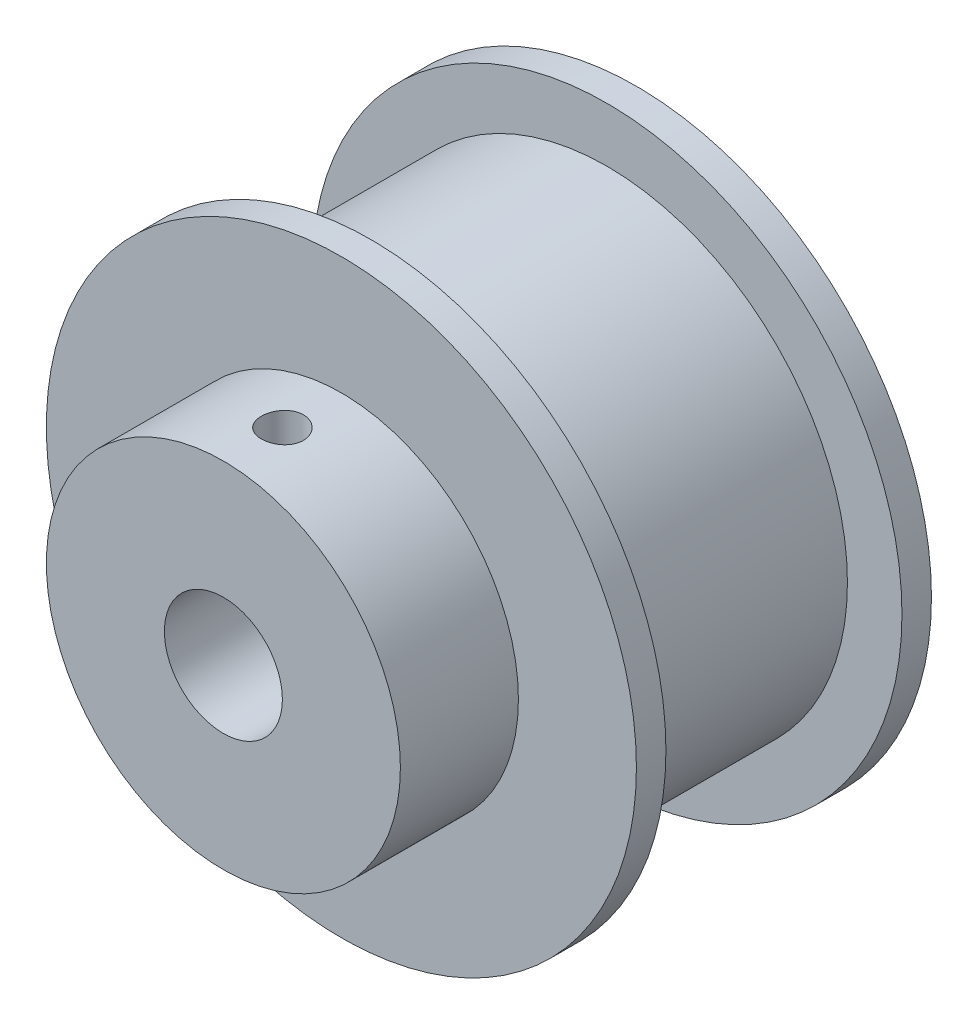
ISO-10303-21;
HEADER;
FILE_DESCRIPTION(('STEP AP214'),'2;1');
FILE_NAME('part.step','',(''),(''),'','','');
FILE_SCHEMA(('AUTOMOTIVE_DESIGN { 1 0 10303 214 1 1 1 1 }'));
ENDSEC;
DATA;
#1=APPLICATION_CONTEXT('core data for automotive mechanical design processes');
#2=APPLICATION_PROTOCOL_DEFINITION('international standard','automotive_design',2000,#1);
#3=PRODUCT_CONTEXT('',#1,'mechanical');
#4=PRODUCT('Part','Part','',(#3));
#5=PRODUCT_RELATED_PRODUCT_CATEGORY('part','',(#4));
#6=PRODUCT_DEFINITION_FORMATION('','',#4);
#7=PRODUCT_DEFINITION_CONTEXT('part definition',#1,'design');
#8=PRODUCT_DEFINITION('design','',#6,#7);
#9=PRODUCT_DEFINITION_SHAPE('','',#8);
#10=(LENGTH_UNIT() NAMED_UNIT(*) SI_UNIT(.MILLI.,.METRE.));
#11=(NAMED_UNIT(*) PLANE_ANGLE_UNIT() SI_UNIT($,.RADIAN.));
#12=(NAMED_UNIT(*) SI_UNIT($,.STERADIAN.) SOLID_ANGLE_UNIT());
#13=UNCERTAINTY_MEASURE_WITH_UNIT(LENGTH_MEASURE(1.E-05),#10,'distance_accuracy_value','');
#14=(GEOMETRIC_REPRESENTATION_CONTEXT(3) GLOBAL_UNCERTAINTY_ASSIGNED_CONTEXT((#13)) GLOBAL_UNIT_ASSIGNED_CONTEXT((#10,
#11,#12)) REPRESENTATION_CONTEXT('',''));
#15=CARTESIAN_POINT('',(0.,0.,0.));
#16=DIRECTION('',(0.,0.,1.));
#17=DIRECTION('',(1.,0.,0.));
#18=AXIS2_PLACEMENT_3D('',#15,#16,#17);
#19=CARTESIAN_POINT('',(0.,0.,0.));
#20=DIRECTION('',(0.,0.,1.));
#21=DIRECTION('',(1.,0.,0.));
#22=AXIS2_PLACEMENT_3D('',#19,#20,#21);
#23=CYLINDRICAL_SURFACE('',#22,9.525);
#24=CARTESIAN_POINT('',(0.,9.525,-2.04470000000001));
#25=CARTESIAN_POINT('',(-0.0632509375219131,9.52499915479188,-2.04470270245697));
#26=CARTESIAN_POINT('',(-0.126542029749757,9.5243633064193,-2.0500271232438));
#27=CARTESIAN_POINT('',(-0.251364820472078,9.52188793721448,-2.07118424036684));
#28=CARTESIAN_POINT('',(-0.312894581904219,9.52004714057458,-2.08702807498671));
#29=CARTESIAN_POINT('',(-0.432369436874992,9.51536936505536,-2.12875218330424));
#30=CARTESIAN_POINT('',(-0.49031684700516,9.51253303804938,-2.1546258905958));
#31=CARTESIAN_POINT('',(-0.601035404846345,9.506180121912,-2.2156613468546));
#32=CARTESIAN_POINT('',(-0.653807476710619,9.50266365456691,-2.25082143340901));
#33=CARTESIAN_POINT('',(-0.75295182295395,9.49532382723018,-2.32961909895453));
#34=CARTESIAN_POINT('',(-0.799294604149035,9.49149917244225,-2.37329366976166));
#35=CARTESIAN_POINT('',(-0.884010990406446,9.48398454417843,-2.46780121878827));
#36=CARTESIAN_POINT('',(-0.922384200022101,9.48029457739318,-2.5186345520125));
#37=CARTESIAN_POINT('',(-0.990180703567408,9.47345427413314,-2.62620658516361));
#38=CARTESIAN_POINT('',(-1.01957659957805,9.47030560217059,-2.68296266738078));
#39=CARTESIAN_POINT('',(-1.06840907808638,9.46492124661159,-2.80064933068694));
#40=CARTESIAN_POINT('',(-1.08784600183097,9.46268553173297,-2.86157976865938));
#41=CARTESIAN_POINT('',(-1.1161197035534,9.45939245018979,-2.98558067429048));
#42=CARTESIAN_POINT('',(-1.12500607633105,9.45832957207026,-3.04863968484435));
#43=CARTESIAN_POINT('',(-1.13207984575786,9.45748558744171,-3.17536229799693));
#44=CARTESIAN_POINT('',(-1.13026763163491,9.45770443430195,-3.23902587851649));
#45=CARTESIAN_POINT('',(-1.11603642445577,9.45939413033264,-3.36480585863814));
#46=CARTESIAN_POINT('',(-1.10367192939602,9.4608585465419,-3.42692852300703));
#47=CARTESIAN_POINT('',(-1.06877210956582,9.46486434331535,-3.54821086751916));
#48=CARTESIAN_POINT('',(-1.04623659739191,9.4674057437232,-3.6073704930454));
#49=CARTESIAN_POINT('',(-0.991575435750873,9.47328648500057,-3.72121752193824));
#50=CARTESIAN_POINT('',(-0.959425968133554,9.47662780348318,-3.77589338322514));
#51=CARTESIAN_POINT('',(-0.886466559501061,9.48373033604865,-3.87909440846158));
#52=CARTESIAN_POINT('',(-0.845656261347889,9.48749156744401,-3.92761931863866));
#53=CARTESIAN_POINT('',(-0.756230970668207,9.49503875161689,-4.01745742183581));
#54=CARTESIAN_POINT('',(-0.707568978368593,9.49882471254411,-4.05872384478604));
#55=CARTESIAN_POINT('',(-0.603983835638156,9.5059728190733,-4.13250986554822));
#56=CARTESIAN_POINT('',(-0.549060673090109,9.50933496385503,-4.16502944643204));
#57=CARTESIAN_POINT('',(-0.434477192227891,9.51525841591306,-4.22039818128805));
#58=CARTESIAN_POINT('',(-0.37481551982548,9.51781949323438,-4.24324455912828));
#59=CARTESIAN_POINT('',(-0.252465658532567,9.52185010274536,-4.27858201850423));
#60=CARTESIAN_POINT('',(-0.18977759738165,9.52331968096283,-4.29107353670023));
#61=CARTESIAN_POINT('',(-0.0635590107666499,9.52499574893122,-4.30528642309018));
#62=CARTESIAN_POINT('',(-3.58400083123205E-05,9.52520979797053,-4.30707224953617));
#63=CARTESIAN_POINT('',(0.126404631849714,9.5243710616825,-4.29999294412866));
#64=CARTESIAN_POINT('',(0.189321944527945,9.52331830061377,-4.29112801623034));
#65=CARTESIAN_POINT('',(0.312575650423429,9.52006897220777,-4.26305237506707));
#66=CARTESIAN_POINT('',(0.372919106821373,9.51787578670261,-4.24387224492876));
#67=CARTESIAN_POINT('',(0.489532754276605,9.51259128030109,-4.19574234807837));
#68=CARTESIAN_POINT('',(0.545802819522162,9.50949993167863,-4.16679227976586));
#69=CARTESIAN_POINT('',(0.652961239170924,9.50274519697551,-4.09978727203576));
#70=CARTESIAN_POINT('',(0.703823242482478,9.49907920769755,-4.06169045722993));
#71=CARTESIAN_POINT('',(0.798454027403533,9.49159384532421,-3.97753284488347));
#72=CARTESIAN_POINT('',(0.842222556073248,9.48777446676533,-3.93147176347326));
#73=CARTESIAN_POINT('',(0.921651327981493,9.48038962493189,-3.83240990885744));
#74=CARTESIAN_POINT('',(0.957268957312501,9.47682556018668,-3.77937484808917));
#75=CARTESIAN_POINT('',(1.01909088187736,9.47037744686408,-3.66803762953532));
#76=CARTESIAN_POINT('',(1.04529534989561,9.46749338580514,-3.60973556845337));
#77=CARTESIAN_POINT('',(1.08747746493127,9.46274116392142,-3.48965919026062));
#78=CARTESIAN_POINT('',(1.10347950086257,9.46087058199655,-3.42789354070565));
#79=CARTESIAN_POINT('',(1.12488122562179,9.45835002776142,-3.30252837334878));
#80=CARTESIAN_POINT('',(1.13028135522926,9.45770000470587,-3.23892893189927));
#81=CARTESIAN_POINT('',(1.1303184331302,9.45769553968786,-3.11212535749611));
#82=CARTESIAN_POINT('',(1.12502232452988,9.45833303967828,-3.04892123389645));
#83=CARTESIAN_POINT('',(1.10395863981905,9.46081450631757,-2.92430798622455));
#84=CARTESIAN_POINT('',(1.08819105929352,9.46265847347512,-2.86289886290915));
#85=CARTESIAN_POINT('',(1.04665229311139,9.4673426850713,-2.74362536688638));
#86=CARTESIAN_POINT('',(1.02088399489125,9.4701826419221,-2.68575997660022));
#87=CARTESIAN_POINT('',(0.960081888687952,9.47653934827966,-2.57516402600584));
#88=CARTESIAN_POINT('',(0.925048010140116,9.48005610294073,-2.52243350480786));
#89=CARTESIAN_POINT('',(0.846459876445609,9.4873965412942,-2.42326157372525));
#90=CARTESIAN_POINT('',(0.802855698093828,9.49122194198921,-2.37685984993572));
#91=CARTESIAN_POINT('',(0.70846795098953,9.49873331929354,-2.29200565583022));
#92=CARTESIAN_POINT('',(0.657682685184867,9.50241926268422,-2.25355506985088));
#93=CARTESIAN_POINT('',(0.550175875241665,9.50925025151029,-2.18558383753544));
#94=CARTESIAN_POINT('',(0.493434507280822,9.51239339223359,-2.1560943717792));
#95=CARTESIAN_POINT('',(0.375800731512535,9.51776504462355,-2.10710365534466));
#96=CARTESIAN_POINT('',(0.314912964671015,9.51999455988771,-2.08759143900469));
#97=CARTESIAN_POINT('',(0.21141811479381,9.5227440281588,-2.06383345788656));
#98=CARTESIAN_POINT('',(0.169466299617015,9.52358594491639,-2.05666858193351));
#99=CARTESIAN_POINT('',(0.0850157018599232,9.524714213129,-2.04710095996014));
#100=CARTESIAN_POINT('',(0.0425169227863941,9.52500056814412,-2.0446981834237));
#101=CARTESIAN_POINT('',(0.,9.525,-2.04470000000001));
#102=B_SPLINE_CURVE_WITH_KNOTS('',3,(#24,#25,#26,#27,#28,#29,#30,#31,#32,#33,#34,#35,#36,#37,
#38,#39,#40,#41,#42,#43,#44,#45,#46,#47,#48,#49,#50,#51,#52,#53,#54,#55,#56,#57,#58,#59,#60,#61,
#62,#63,#64,#65,#66,#67,#68,#69,#70,#71,#72,#73,#74,#75,#76,#77,#78,#79,#80,#81,#82,#83,#84,#85,
#86,#87,#88,#89,#90,#91,#92,#93,#94,#95,#96,#97,#98,#99,#100,#101),.UNSPECIFIED.,.T.,.F.,(4,2,2,
2,2,2,2,2,2,2,2,2,2,2,2,2,2,2,2,2,2,2,2,2,2,2,2,2,2,2,2,2,2,2,2,2,2,2,4),(0.,0.189597524312163,
0.379396121234883,0.569070669169938,0.758711285265448,0.949194948105548,1.13968806040505,
1.33075686013228,1.52181911239724,1.71197964005891,1.90213324948718,2.09131069927981,
2.28049163485501,2.4701451964838,2.65980658018673,2.8506485273792,3.04149084391374,
3.232387893604,3.4232768928326,3.61301539850875,3.80275027087081,3.99192568241037,
4.18110693437604,4.37117138460746,4.56124261068453,4.75228593782411,4.94332575806604,
5.13390716820241,5.32448065465381,5.51386512071868,5.70324966663245,5.89257957351563,
6.08191092233625,6.27237971236643,6.4628935899097,6.65406297150348,6.8450217911509,
6.97246899232318,7.09991537679581),.UNSPECIFIED.);
#103=CARTESIAN_POINT('',(0.,9.525,-2.04470000000001));
#104=VERTEX_POINT('',#103);
#105=EDGE_CURVE('E82',#104,#104,#102,.T.);
#106=ORIENTED_EDGE('',*,*,#105,.T.);
#107=EDGE_LOOP('',(#106));
#108=FACE_BOUND('',#107,.T.);
#109=CARTESIAN_POINT('',(0.,0.,0.));
#110=DIRECTION('',(0.,0.,1.));
#111=DIRECTION('',(1.,0.,0.));
#112=AXIS2_PLACEMENT_3D('',#109,#110,#111);
#113=CIRCLE('',#112,9.525);
#114=CARTESIAN_POINT('',(9.525,0.,0.));
#115=VERTEX_POINT('',#114);
#116=EDGE_CURVE('E11',#115,#115,#113,.T.);
#117=ORIENTED_EDGE('',*,*,#116,.F.);
#118=EDGE_LOOP('',(#117));
#119=FACE_BOUND('',#118,.T.);
#120=CARTESIAN_POINT('',(0.,0.,-6.35));
#121=DIRECTION('',(0.,0.,1.));
#122=DIRECTION('',(1.,0.,0.));
#123=AXIS2_PLACEMENT_3D('',#120,#121,#122);
#124=CIRCLE('',#123,9.525);
#125=CARTESIAN_POINT('',(9.525,0.,-6.35));
#126=VERTEX_POINT('',#125);
#127=EDGE_CURVE('E112',#126,#126,#124,.T.);
#128=ORIENTED_EDGE('',*,*,#127,.T.);
#129=EDGE_LOOP('',(#128));
#130=FACE_BOUND('',#129,.T.);
#131=ADVANCED_FACE('F38',(#108,#119,#130),#23,.T.);
#132=CARTESIAN_POINT('',(0.,9.525,0.));
#133=DIRECTION('',(0.,0.,-1.));
#134=DIRECTION('',(-1.,0.,0.));
#135=AXIS2_PLACEMENT_3D('',#132,#133,#134);
#136=PLANE('',#135);
#137=CARTESIAN_POINT('',(0.,0.,0.));
#138=DIRECTION('',(0.,0.,1.));
#139=DIRECTION('',(1.,0.,0.));
#140=AXIS2_PLACEMENT_3D('',#137,#138,#139);
#141=CIRCLE('',#140,3.175);
#142=CARTESIAN_POINT('',(3.175,0.,0.));
#143=VERTEX_POINT('',#142);
#144=EDGE_CURVE('E46',#143,#143,#141,.T.);
#145=ORIENTED_EDGE('',*,*,#144,.F.);
#146=EDGE_LOOP('',(#145));
#147=FACE_BOUND('',#146,.T.);
#148=ORIENTED_EDGE('',*,*,#116,.T.);
#149=EDGE_LOOP('',(#148));
#150=FACE_BOUND('',#149,.T.);
#151=ADVANCED_FACE('F140',(#147,#150),#136,.F.);
#152=CARTESIAN_POINT('',(0.,0.,0.));
#153=DIRECTION('',(0.,0.,1.));
#154=DIRECTION('',(1.,0.,0.));
#155=AXIS2_PLACEMENT_3D('',#152,#153,#154);
#156=CYLINDRICAL_SURFACE('',#155,3.175);
#157=CARTESIAN_POINT('',(0.,3.175,-2.04470000000001));
#158=CARTESIAN_POINT('',(0.0614285544766775,3.17500087649076,-2.04469877624258));
#159=CARTESIAN_POINT('',(0.122848391480887,3.17320130070143,-2.04972367898314));
#160=CARTESIAN_POINT('',(0.243864611742384,3.1662010034201,-2.06961858543575));
#161=CARTESIAN_POINT('',(0.303461052111786,3.16100038856924,-2.08448828045996));
#162=CARTESIAN_POINT('',(0.419068309151045,3.14775949893737,-2.12348844997215));
#163=CARTESIAN_POINT('',(0.475085403185974,3.13972436624609,-2.14760216174167));
#164=CARTESIAN_POINT('',(0.582278041616503,3.12162393487057,-2.20432504012241));
#165=CARTESIAN_POINT('',(0.63345243149865,3.11155815385673,-2.23693622563318));
#166=CARTESIAN_POINT('',(0.731495005230027,3.09000790855595,-2.31105507992649));
#167=CARTESIAN_POINT('',(0.778149616243894,3.07848610582585,-2.35283431689856));
#168=CARTESIAN_POINT('',(0.863958107942655,3.055516031792,-2.44352654130838));
#169=CARTESIAN_POINT('',(0.903110009958687,3.04406778065305,-2.49244140463129));
#170=CARTESIAN_POINT('',(0.974093633832353,3.02211785986225,-2.59802569017699));
#171=CARTESIAN_POINT('',(1.00563502809096,3.01166094904186,-2.65490051833327));
#172=CARTESIAN_POINT('',(1.05861134705909,2.99345244738711,-2.77357939759986));
#173=CARTESIAN_POINT('',(1.08004985661479,2.98569989720789,-2.8353816911635));
#174=CARTESIAN_POINT('',(1.11138819305282,2.9741742173714,-2.9597149448491));
#175=CARTESIAN_POINT('',(1.12169236541681,2.97026214805179,-3.0221306997839));
#176=CARTESIAN_POINT('',(1.13173392893204,2.96645158379256,-3.14791847859527));
#177=CARTESIAN_POINT('',(1.13147514856466,2.96655163468287,-3.21129014768161));
#178=CARTESIAN_POINT('',(1.12070953557278,2.97063328242024,-3.3336133661018));
#179=CARTESIAN_POINT('',(1.11074743190181,2.9744085523292,-3.39262097911382));
#180=CARTESIAN_POINT('',(1.08175290027524,2.98507483987672,-3.50806464240935));
#181=CARTESIAN_POINT('',(1.06271924100947,2.99196628047622,-3.56450034245956));
#182=CARTESIAN_POINT('',(1.01579639288465,3.00822311818093,-3.67436762329595));
#183=CARTESIAN_POINT('',(0.98775662564137,3.01763009039322,-3.72772847353732));
#184=CARTESIAN_POINT('',(0.923722187948481,3.03784253722577,-3.82915226072601));
#185=CARTESIAN_POINT('',(0.887724971743376,3.04864845893998,-3.87721349482272));
#186=CARTESIAN_POINT('',(0.806247147627662,3.0712342285018,-3.96971122491127));
#187=CARTESIAN_POINT('',(0.760326653485437,3.08303358094073,-4.01375635543315));
#188=CARTESIAN_POINT('',(0.661610098844965,3.10571393948941,-4.09363040690295));
#189=CARTESIAN_POINT('',(0.608813181467748,3.11659483086972,-4.12945830235303));
#190=CARTESIAN_POINT('',(0.496923650490418,3.13639217173446,-4.19225643876642));
#191=CARTESIAN_POINT('',(0.437759573781156,3.14528190725224,-4.21910836273788));
#192=CARTESIAN_POINT('',(0.31535998984196,3.15989936928577,-4.2623520019204));
#193=CARTESIAN_POINT('',(0.252126116160288,3.16562835574328,-4.27874788553834));
#194=CARTESIAN_POINT('',(0.126684885961714,3.17306329879329,-4.29988948929031));
#195=CARTESIAN_POINT('',(0.0645771816882159,3.17495136824996,-4.30516304433809));
#196=CARTESIAN_POINT('',(-0.0596565359676966,3.17504672531149,-4.30543160042332));
#197=CARTESIAN_POINT('',(-0.121782543364872,3.1732547352019,-4.30042861843736));
#198=CARTESIAN_POINT('',(-0.2420876895595,3.16631168752833,-4.28069555255756));
#199=CARTESIAN_POINT('',(-0.300329231110409,3.16127656517542,-4.26630097687732));
#200=CARTESIAN_POINT('',(-0.413538192846497,3.14846933320479,-4.22862458392996));
#201=CARTESIAN_POINT('',(-0.468505187040125,3.14069686838655,-4.20534161326216));
#202=CARTESIAN_POINT('',(-0.575332725471089,3.12292068057346,-4.14983109763225));
#203=CARTESIAN_POINT('',(-0.62706241789348,3.11286035066926,-4.11737039982098));
#204=CARTESIAN_POINT('',(-0.724505279210258,3.09163517782237,-4.04469392625775));
#205=CARTESIAN_POINT('',(-0.770216385550679,3.08046995852105,-4.00447550353221));
#206=CARTESIAN_POINT('',(-0.856811848575496,3.05754963314883,-3.91495158635895));
#207=CARTESIAN_POINT('',(-0.897320261231916,3.0457941243994,-3.86528162488484));
#208=CARTESIAN_POINT('',(-0.96948829647317,3.02359841598846,-3.75960588734371));
#209=CARTESIAN_POINT('',(-1.00114750732455,3.01315827754059,-3.70359981664202));
#210=CARTESIAN_POINT('',(-1.05465477079429,2.99485112677041,-3.58660726309193));
#211=CARTESIAN_POINT('',(-1.07649405053023,2.98698641696941,-3.52561638418745));
#212=CARTESIAN_POINT('',(-1.10946944902859,2.97489781303426,-3.40047036605966));
#213=CARTESIAN_POINT('',(-1.12061131703489,2.97067196334806,-3.33631694603455));
#214=CARTESIAN_POINT('',(-1.13139068963521,2.96658222044346,-3.21069434395218));
#215=CARTESIAN_POINT('',(-1.13166111008652,2.9664783574786,-3.14928675952382));
#216=CARTESIAN_POINT('',(-1.12228164306422,2.97003931415379,-3.02735111764559));
#217=CARTESIAN_POINT('',(-1.1126325176599,2.97370384428697,-2.96682299299347));
#218=CARTESIAN_POINT('',(-1.08416089230554,2.98419839475886,-2.84987294880746));
#219=CARTESIAN_POINT('',(-1.06557142470546,2.9909477964968,-2.79338646868559));
#220=CARTESIAN_POINT('',(-1.01994372799953,3.0068123311106,-2.68429540767603));
#221=CARTESIAN_POINT('',(-0.992903472899541,3.01592803119462,-2.63169176140234));
#222=CARTESIAN_POINT('',(-0.929616151238455,3.03604854272464,-2.52909051132457));
#223=CARTESIAN_POINT('',(-0.892986233526769,3.0471235224069,-2.4793429511517));
#224=CARTESIAN_POINT('',(-0.812177154252531,3.06964995874745,-2.38649729256409));
#225=CARTESIAN_POINT('',(-0.767995717285472,3.08110152803636,-2.34340120582446));
#226=CARTESIAN_POINT('',(-0.670861718733724,3.10373428576573,-2.26303642120086));
#227=CARTESIAN_POINT('',(-0.617595515492274,3.11487776157142,-2.22613466782598));
#228=CARTESIAN_POINT('',(-0.505234578584043,3.13506244460878,-2.16183451178947));
#229=CARTESIAN_POINT('',(-0.446140340356561,3.14410383031939,-2.13443530221262));
#230=CARTESIAN_POINT('',(-0.323645197027847,3.15906443826106,-2.09006649917454));
#231=CARTESIAN_POINT('',(-0.260236860921374,3.16497811106267,-2.07311543486654));
#232=CARTESIAN_POINT('',(-0.13121513161262,3.17294468299437,-2.05043499228508));
#233=CARTESIAN_POINT('',(-0.0656025945972242,3.17499906395212,-2.04470130691115));
#234=CARTESIAN_POINT('',(0.,3.175,-2.04470000000001));
#235=B_SPLINE_CURVE_WITH_KNOTS('',3,(#157,#158,#159,#160,#161,#162,#163,#164,#165,#166,#167,
#168,#169,#170,#171,#172,#173,#174,#175,#176,#177,#178,#179,#180,#181,#182,#183,#184,#185,#186,
#187,#188,#189,#190,#191,#192,#193,#194,#195,#196,#197,#198,#199,#200,#201,#202,#203,#204,#205,
#206,#207,#208,#209,#210,#211,#212,#213,#214,#215,#216,#217,#218,#219,#220,#221,#222,#223,#224,
#225,#226,#227,#228,#229,#230,#231,#232,#233,#234),.UNSPECIFIED.,.T.,.F.,(4,2,2,2,2,2,2,2,2,2,2,
2,2,2,2,2,2,2,2,2,2,2,2,2,2,2,2,2,2,2,2,2,2,2,2,2,2,2,4),(0.,0.184043941459559,
0.368082112412804,0.55178812280708,0.735537819443362,0.925722644883201,1.11595755842548,
1.31258758821647,1.50914779437034,1.69830149435246,1.88738663727475,2.0664345293368,
2.24550673104464,2.42774410221585,2.61003985955345,2.80329006106036,2.99656436677722,
3.19229416831943,3.38794589132548,3.57408187032766,3.76018131989989,3.93997181359126,
4.11978564569257,4.30465683345394,4.48959121210527,4.68416822385534,4.87875428732968,
5.07351384543876,5.26816867279114,5.45147357003616,5.63476438593101,5.81351722268546,
5.99231294661073,6.17977826003498,6.36730015993199,6.56359488860402,6.75987294468711,
6.95649809396628,7.15304773089825),.UNSPECIFIED.);
#236=CARTESIAN_POINT('',(0.,3.175,-2.04470000000001));
#237=VERTEX_POINT('',#236);
#238=EDGE_CURVE('E244',#237,#237,#235,.T.);
#239=ORIENTED_EDGE('',*,*,#238,.T.);
#240=EDGE_LOOP('',(#239));
#241=FACE_BOUND('',#240,.T.);
#242=CARTESIAN_POINT('',(0.,0.,-22.225));
#243=DIRECTION('',(0.,0.,1.));
#244=DIRECTION('',(1.,0.,0.));
#245=AXIS2_PLACEMENT_3D('',#242,#243,#244);
#246=CIRCLE('',#245,3.175);
#247=CARTESIAN_POINT('',(3.175,0.,-22.225));
#248=VERTEX_POINT('',#247);
#249=EDGE_CURVE('E133',#248,#248,#246,.T.);
#250=ORIENTED_EDGE('',*,*,#249,.F.);
#251=EDGE_LOOP('',(#250));
#252=FACE_BOUND('',#251,.T.);
#253=ORIENTED_EDGE('',*,*,#144,.T.);
#254=EDGE_LOOP('',(#253));
#255=FACE_BOUND('',#254,.T.);
#256=ADVANCED_FACE('F138',(#241,#252,#255),#156,.F.);
#257=CARTESIAN_POINT('',(0.,15.875,-22.225));
#258=DIRECTION('',(0.,0.,1.));
#259=DIRECTION('',(1.,0.,0.));
#260=AXIS2_PLACEMENT_3D('',#257,#258,#259);
#261=PLANE('',#260);
#262=CARTESIAN_POINT('',(0.,7.9375,-22.225));
#263=DIRECTION('',(0.,0.,-1.));
#264=DIRECTION('',(-1.,0.,0.));
#265=AXIS2_PLACEMENT_3D('',#262,#263,#264);
#266=CIRCLE('',#265,1.1303);
#267=CARTESIAN_POINT('',(-1.1303,7.9375,-22.225));
#268=VERTEX_POINT('',#267);
#269=EDGE_CURVE('E76',#268,#268,#266,.T.);
#270=ORIENTED_EDGE('',*,*,#269,.F.);
#271=EDGE_LOOP('',(#270));
#272=FACE_BOUND('',#271,.T.);
#273=CARTESIAN_POINT('',(-6.87407664253921,3.96875000000039,-22.225));
#274=DIRECTION('',(0.,0.,-1.));
#275=DIRECTION('',(-1.,0.,0.));
#276=AXIS2_PLACEMENT_3D('',#273,#274,#275);
#277=CIRCLE('',#276,1.1303);
#278=CARTESIAN_POINT('',(-8.00437664253921,3.96875000000039,-22.225));
#279=VERTEX_POINT('',#278);
#280=EDGE_CURVE('E75',#279,#279,#277,.T.);
#281=ORIENTED_EDGE('',*,*,#280,.F.);
#282=EDGE_LOOP('',(#281));
#283=FACE_BOUND('',#282,.T.);
#284=CARTESIAN_POINT('',(-6.87407664253966,-3.96874999999961,-22.225));
#285=DIRECTION('',(0.,0.,-1.));
#286=DIRECTION('',(-1.,0.,0.));
#287=AXIS2_PLACEMENT_3D('',#284,#285,#286);
#288=CIRCLE('',#287,1.1303);
#289=CARTESIAN_POINT('',(-8.00437664253966,-3.96874999999961,-22.225));
#290=VERTEX_POINT('',#289);
#291=EDGE_CURVE('E88',#290,#290,#288,.T.);
#292=ORIENTED_EDGE('',*,*,#291,.F.);
#293=EDGE_LOOP('',(#292));
#294=FACE_BOUND('',#293,.T.);
#295=CARTESIAN_POINT('',(-9.00445147621681E-13,-7.9375,-22.225));
#296=DIRECTION('',(0.,0.,-1.));
#297=DIRECTION('',(-1.,0.,0.));
#298=AXIS2_PLACEMENT_3D('',#295,#296,#297);
#299=CIRCLE('',#298,1.1303);
#300=CARTESIAN_POINT('',(-1.1303000000009,-7.9375,-22.225));
#301=VERTEX_POINT('',#300);
#302=EDGE_CURVE('E94',#301,#301,#299,.T.);
#303=ORIENTED_EDGE('',*,*,#302,.F.);
#304=EDGE_LOOP('',(#303));
#305=FACE_BOUND('',#304,.T.);
#306=CARTESIAN_POINT('',(6.8740766425383,-3.96875000000039,-22.225));
#307=DIRECTION('',(0.,0.,-1.));
#308=DIRECTION('',(-1.,0.,0.));
#309=AXIS2_PLACEMENT_3D('',#306,#307,#308);
#310=CIRCLE('',#309,1.1303);
#311=CARTESIAN_POINT('',(5.7437766425383,-3.96875000000039,-22.225));
#312=VERTEX_POINT('',#311);
#313=EDGE_CURVE('E100',#312,#312,#310,.T.);
#314=ORIENTED_EDGE('',*,*,#313,.F.);
#315=EDGE_LOOP('',(#314));
#316=FACE_BOUND('',#315,.T.);
#317=CARTESIAN_POINT('',(6.87407664253876,3.96874999999961,-22.225));
#318=DIRECTION('',(0.,0.,-1.));
#319=DIRECTION('',(-1.,0.,0.));
#320=AXIS2_PLACEMENT_3D('',#317,#318,#319);
#321=CIRCLE('',#320,1.1303);
#322=CARTESIAN_POINT('',(5.74377664253876,3.96874999999961,-22.225));
#323=VERTEX_POINT('',#322);
#324=EDGE_CURVE('E106',#323,#323,#321,.T.);
#325=ORIENTED_EDGE('',*,*,#324,.F.);
#326=EDGE_LOOP('',(#325));
#327=FACE_BOUND('',#326,.T.);
#328=CARTESIAN_POINT('',(0.,0.,-22.225));
#329=DIRECTION('',(0.,0.,1.));
#330=DIRECTION('',(1.,0.,0.));
#331=AXIS2_PLACEMENT_3D('',#328,#329,#330);
#332=CIRCLE('',#331,15.875);
#333=CARTESIAN_POINT('',(15.875,0.,-22.225));
#334=VERTEX_POINT('',#333);
#335=EDGE_CURVE('E130',#334,#334,#332,.T.);
#336=ORIENTED_EDGE('',*,*,#335,.F.);
#337=EDGE_LOOP('',(#336));
#338=FACE_BOUND('',#337,.T.);
#339=ORIENTED_EDGE('',*,*,#249,.T.);
#340=EDGE_LOOP('',(#339));
#341=FACE_BOUND('',#340,.T.);
#342=ADVANCED_FACE('F184',(#272,#283,#294,#305,#316,#327,#338,#341),#261,.F.);
#343=CARTESIAN_POINT('',(0.,0.,0.));
#344=DIRECTION('',(0.,0.,1.));
#345=DIRECTION('',(1.,0.,0.));
#346=AXIS2_PLACEMENT_3D('',#343,#344,#345);
#347=CYLINDRICAL_SURFACE('',#346,15.875);
#348=CARTESIAN_POINT('',(0.,0.,-20.6375));
#349=DIRECTION('',(0.,0.,1.));
#350=DIRECTION('',(1.,0.,0.));
#351=AXIS2_PLACEMENT_3D('',#348,#349,#350);
#352=CIRCLE('',#351,15.875);
#353=CARTESIAN_POINT('',(15.875,0.,-20.6375));
#354=VERTEX_POINT('',#353);
#355=EDGE_CURVE('E127',#354,#354,#352,.T.);
#356=ORIENTED_EDGE('',*,*,#355,.F.);
#357=EDGE_LOOP('',(#356));
#358=FACE_BOUND('',#357,.T.);
#359=ORIENTED_EDGE('',*,*,#335,.T.);
#360=EDGE_LOOP('',(#359));
#361=FACE_BOUND('',#360,.T.);
#362=ADVANCED_FACE('F178',(#358,#361),#347,.T.);
#363=CARTESIAN_POINT('',(0.,12.9413,-20.6375));
#364=DIRECTION('',(0.,0.,-1.));
#365=DIRECTION('',(-1.,0.,0.));
#366=AXIS2_PLACEMENT_3D('',#363,#364,#365);
#367=PLANE('',#366);
#368=CARTESIAN_POINT('',(0.,0.,-20.6375));
#369=DIRECTION('',(0.,0.,1.));
#370=DIRECTION('',(1.,0.,0.));
#371=AXIS2_PLACEMENT_3D('',#368,#369,#370);
#372=CIRCLE('',#371,12.9413);
#373=CARTESIAN_POINT('',(12.9413,0.,-20.6375));
#374=VERTEX_POINT('',#373);
#375=EDGE_CURVE('E124',#374,#374,#372,.T.);
#376=ORIENTED_EDGE('',*,*,#375,.F.);
#377=EDGE_LOOP('',(#376));
#378=FACE_BOUND('',#377,.T.);
#379=ORIENTED_EDGE('',*,*,#355,.T.);
#380=EDGE_LOOP('',(#379));
#381=FACE_BOUND('',#380,.T.);
#382=ADVANCED_FACE('F172',(#378,#381),#367,.F.);
#383=CARTESIAN_POINT('',(0.,0.,0.));
#384=DIRECTION('',(0.,0.,1.));
#385=DIRECTION('',(1.,0.,0.));
#386=AXIS2_PLACEMENT_3D('',#383,#384,#385);
#387=CYLINDRICAL_SURFACE('',#386,12.9413);
#388=CARTESIAN_POINT('',(0.,0.,-7.9375));
#389=DIRECTION('',(0.,0.,1.));
#390=DIRECTION('',(1.,0.,0.));
#391=AXIS2_PLACEMENT_3D('',#388,#389,#390);
#392=CIRCLE('',#391,12.9413);
#393=CARTESIAN_POINT('',(12.9413,0.,-7.9375));
#394=VERTEX_POINT('',#393);
#395=EDGE_CURVE('E121',#394,#394,#392,.T.);
#396=ORIENTED_EDGE('',*,*,#395,.F.);
#397=EDGE_LOOP('',(#396));
#398=FACE_BOUND('',#397,.T.);
#399=ORIENTED_EDGE('',*,*,#375,.T.);
#400=EDGE_LOOP('',(#399));
#401=FACE_BOUND('',#400,.T.);
#402=ADVANCED_FACE('F166',(#398,#401),#387,.T.);
#403=CARTESIAN_POINT('',(0.,15.875,-7.9375));
#404=DIRECTION('',(0.,0.,1.));
#405=DIRECTION('',(1.,0.,0.));
#406=AXIS2_PLACEMENT_3D('',#403,#404,#405);
#407=PLANE('',#406);
#408=CARTESIAN_POINT('',(0.,0.,-7.9375));
#409=DIRECTION('',(0.,0.,1.));
#410=DIRECTION('',(1.,0.,0.));
#411=AXIS2_PLACEMENT_3D('',#408,#409,#410);
#412=CIRCLE('',#411,15.875);
#413=CARTESIAN_POINT('',(15.875,0.,-7.9375));
#414=VERTEX_POINT('',#413);
#415=EDGE_CURVE('E118',#414,#414,#412,.T.);
#416=ORIENTED_EDGE('',*,*,#415,.F.);
#417=EDGE_LOOP('',(#416));
#418=FACE_BOUND('',#417,.T.);
#419=ORIENTED_EDGE('',*,*,#395,.T.);
#420=EDGE_LOOP('',(#419));
#421=FACE_BOUND('',#420,.T.);
#422=ADVANCED_FACE('F160',(#418,#421),#407,.F.);
#423=CARTESIAN_POINT('',(0.,0.,0.));
#424=DIRECTION('',(0.,0.,1.));
#425=DIRECTION('',(1.,0.,0.));
#426=AXIS2_PLACEMENT_3D('',#423,#424,#425);
#427=CYLINDRICAL_SURFACE('',#426,15.875);
#428=CARTESIAN_POINT('',(0.,0.,-6.35));
#429=DIRECTION('',(0.,0.,1.));
#430=DIRECTION('',(1.,0.,0.));
#431=AXIS2_PLACEMENT_3D('',#428,#429,#430);
#432=CIRCLE('',#431,15.875);
#433=CARTESIAN_POINT('',(15.875,0.,-6.35));
#434=VERTEX_POINT('',#433);
#435=EDGE_CURVE('E115',#434,#434,#432,.T.);
#436=ORIENTED_EDGE('',*,*,#435,.F.);
#437=EDGE_LOOP('',(#436));
#438=FACE_BOUND('',#437,.T.);
#439=ORIENTED_EDGE('',*,*,#415,.T.);
#440=EDGE_LOOP('',(#439));
#441=FACE_BOUND('',#440,.T.);
#442=ADVANCED_FACE('F154',(#438,#441),#427,.T.);
#443=CARTESIAN_POINT('',(0.,9.525,-6.35));
#444=DIRECTION('',(0.,0.,-1.));
#445=DIRECTION('',(-1.,0.,0.));
#446=AXIS2_PLACEMENT_3D('',#443,#444,#445);
#447=PLANE('',#446);
#448=ORIENTED_EDGE('',*,*,#127,.F.);
#449=EDGE_LOOP('',(#448));
#450=FACE_BOUND('',#449,.T.);
#451=ORIENTED_EDGE('',*,*,#435,.T.);
#452=EDGE_LOOP('',(#451));
#453=FACE_BOUND('',#452,.T.);
#454=ADVANCED_FACE('F150',(#450,#453),#447,.F.);
#455=CARTESIAN_POINT('',(6.87407664253876,3.96874999999961,-13.335));
#456=DIRECTION('',(0.,0.,-1.));
#457=DIRECTION('',(-1.,0.,0.));
#458=AXIS2_PLACEMENT_3D('',#455,#456,#457);
#459=CONICAL_SURFACE('',#458,1.1303,1.02974425867665);
#460=CARTESIAN_POINT('',(6.87407664253875,3.96874999999961,-12.6558472423132));
#461=VERTEX_POINT('',#460);
#462=VERTEX_LOOP('',#461);
#463=FACE_BOUND('',#462,.T.);
#464=CARTESIAN_POINT('',(6.87407664253876,3.96874999999961,-13.335));
#465=DIRECTION('',(0.,0.,-1.));
#466=DIRECTION('',(-1.,0.,0.));
#467=AXIS2_PLACEMENT_3D('',#464,#465,#466);
#468=CIRCLE('',#467,1.1303);
#469=CARTESIAN_POINT('',(5.74377664253876,3.96874999999961,-13.335));
#470=VERTEX_POINT('',#469);
#471=EDGE_CURVE('E109',#470,#470,#468,.T.);
#472=ORIENTED_EDGE('',*,*,#471,.T.);
#473=EDGE_LOOP('',(#472));
#474=FACE_BOUND('',#473,.T.);
#475=ADVANCED_FACE('F153',(#463,#474),#459,.F.);
#476=CARTESIAN_POINT('',(6.87407664253876,3.96874999999961,-22.225));
#477=DIRECTION('',(0.,0.,-1.));
#478=DIRECTION('',(-1.,0.,0.));
#479=AXIS2_PLACEMENT_3D('',#476,#477,#478);
#480=CYLINDRICAL_SURFACE('',#479,1.1303);
#481=ORIENTED_EDGE('',*,*,#471,.F.);
#482=EDGE_LOOP('',(#481));
#483=FACE_BOUND('',#482,.T.);
#484=ORIENTED_EDGE('',*,*,#324,.T.);
#485=EDGE_LOOP('',(#484));
#486=FACE_BOUND('',#485,.T.);
#487=ADVANCED_FACE('F203',(#483,#486),#480,.F.);
#488=CARTESIAN_POINT('',(6.8740766425383,-3.96875000000039,-13.335));
#489=DIRECTION('',(0.,0.,-1.));
#490=DIRECTION('',(-1.,0.,0.));
#491=AXIS2_PLACEMENT_3D('',#488,#489,#490);
#492=CONICAL_SURFACE('',#491,1.1303,1.02974425867665);
#493=CARTESIAN_POINT('',(6.8740766425383,-3.96875000000039,-12.6558472423132));
#494=VERTEX_POINT('',#493);
#495=VERTEX_LOOP('',#494);
#496=FACE_BOUND('',#495,.T.);
#497=CARTESIAN_POINT('',(6.8740766425383,-3.96875000000039,-13.335));
#498=DIRECTION('',(0.,0.,-1.));
#499=DIRECTION('',(-1.,0.,0.));
#500=AXIS2_PLACEMENT_3D('',#497,#498,#499);
#501=CIRCLE('',#500,1.1303);
#502=CARTESIAN_POINT('',(5.74377664253831,-3.96875000000039,-13.335));
#503=VERTEX_POINT('',#502);
#504=EDGE_CURVE('E103',#503,#503,#501,.T.);
#505=ORIENTED_EDGE('',*,*,#504,.T.);
#506=EDGE_LOOP('',(#505));
#507=FACE_BOUND('',#506,.T.);
#508=ADVANCED_FACE('F206',(#496,#507),#492,.F.);
#509=CARTESIAN_POINT('',(6.8740766425383,-3.96875000000039,-22.225));
#510=DIRECTION('',(0.,0.,-1.));
#511=DIRECTION('',(-1.,0.,0.));
#512=AXIS2_PLACEMENT_3D('',#509,#510,#511);
#513=CYLINDRICAL_SURFACE('',#512,1.1303);
#514=ORIENTED_EDGE('',*,*,#504,.F.);
#515=EDGE_LOOP('',(#514));
#516=FACE_BOUND('',#515,.T.);
#517=ORIENTED_EDGE('',*,*,#313,.T.);
#518=EDGE_LOOP('',(#517));
#519=FACE_BOUND('',#518,.T.);
#520=ADVANCED_FACE('F210',(#516,#519),#513,.F.);
#521=CARTESIAN_POINT('',(-9.00445147621681E-13,-7.9375,-13.335));
#522=DIRECTION('',(0.,0.,-1.));
#523=DIRECTION('',(-1.,0.,0.));
#524=AXIS2_PLACEMENT_3D('',#521,#522,#523);
#525=CONICAL_SURFACE('',#524,1.1303,1.02974425867665);
#526=CARTESIAN_POINT('',(-9.02788914080731E-13,-7.9375,-12.6558472423132));
#527=VERTEX_POINT('',#526);
#528=VERTEX_LOOP('',#527);
#529=FACE_BOUND('',#528,.T.);
#530=CARTESIAN_POINT('',(-9.00445147621681E-13,-7.9375,-13.335));
#531=DIRECTION('',(0.,0.,-1.));
#532=DIRECTION('',(-1.,0.,0.));
#533=AXIS2_PLACEMENT_3D('',#530,#531,#532);
#534=CIRCLE('',#533,1.1303);
#535=CARTESIAN_POINT('',(-1.1303000000009,-7.9375,-13.335));
#536=VERTEX_POINT('',#535);
#537=EDGE_CURVE('E97',#536,#536,#534,.T.);
#538=ORIENTED_EDGE('',*,*,#537,.T.);
#539=EDGE_LOOP('',(#538));
#540=FACE_BOUND('',#539,.T.);
#541=ADVANCED_FACE('F213',(#529,#540),#525,.F.);
#542=CARTESIAN_POINT('',(-9.00445147621681E-13,-7.9375,-22.225));
#543=DIRECTION('',(0.,0.,-1.));
#544=DIRECTION('',(-1.,0.,0.));
#545=AXIS2_PLACEMENT_3D('',#542,#543,#544);
#546=CYLINDRICAL_SURFACE('',#545,1.1303);
#547=ORIENTED_EDGE('',*,*,#537,.F.);
#548=EDGE_LOOP('',(#547));
#549=FACE_BOUND('',#548,.T.);
#550=ORIENTED_EDGE('',*,*,#302,.T.);
#551=EDGE_LOOP('',(#550));
#552=FACE_BOUND('',#551,.T.);
#553=ADVANCED_FACE('F217',(#549,#552),#546,.F.);
#554=CARTESIAN_POINT('',(-6.87407664253966,-3.96874999999961,-13.335));
#555=DIRECTION('',(0.,0.,-1.));
#556=DIRECTION('',(-1.,0.,0.));
#557=AXIS2_PLACEMENT_3D('',#554,#555,#556);
#558=CONICAL_SURFACE('',#557,1.1303,1.02974425867665);
#559=CARTESIAN_POINT('',(-6.87407664253966,-3.96874999999961,-12.6558472423132));
#560=VERTEX_POINT('',#559);
#561=VERTEX_LOOP('',#560);
#562=FACE_BOUND('',#561,.T.);
#563=CARTESIAN_POINT('',(-6.87407664253966,-3.96874999999961,-13.335));
#564=DIRECTION('',(0.,0.,-1.));
#565=DIRECTION('',(-1.,0.,0.));
#566=AXIS2_PLACEMENT_3D('',#563,#564,#565);
#567=CIRCLE('',#566,1.1303);
#568=CARTESIAN_POINT('',(-8.00437664253966,-3.96874999999961,-13.335));
#569=VERTEX_POINT('',#568);
#570=EDGE_CURVE('E91',#569,#569,#567,.T.);
#571=ORIENTED_EDGE('',*,*,#570,.T.);
#572=EDGE_LOOP('',(#571));
#573=FACE_BOUND('',#572,.T.);
#574=ADVANCED_FACE('F221',(#562,#573),#558,.F.);
#575=CARTESIAN_POINT('',(-6.87407664253966,-3.96874999999961,-22.225));
#576=DIRECTION('',(0.,0.,-1.));
#577=DIRECTION('',(-1.,0.,0.));
#578=AXIS2_PLACEMENT_3D('',#575,#576,#577);
#579=CYLINDRICAL_SURFACE('',#578,1.1303);
#580=ORIENTED_EDGE('',*,*,#570,.F.);
#581=EDGE_LOOP('',(#580));
#582=FACE_BOUND('',#581,.T.);
#583=ORIENTED_EDGE('',*,*,#291,.T.);
#584=EDGE_LOOP('',(#583));
#585=FACE_BOUND('',#584,.T.);
#586=ADVANCED_FACE('F225',(#582,#585),#579,.F.);
#587=CARTESIAN_POINT('',(-6.87407664253921,3.96875000000039,-13.335));
#588=DIRECTION('',(0.,0.,-1.));
#589=DIRECTION('',(-1.,0.,0.));
#590=AXIS2_PLACEMENT_3D('',#587,#588,#589);
#591=CONICAL_SURFACE('',#590,1.1303,1.02974425867665);
#592=CARTESIAN_POINT('',(-6.87407664253921,3.96875000000039,-12.6558472423132));
#593=VERTEX_POINT('',#592);
#594=VERTEX_LOOP('',#593);
#595=FACE_BOUND('',#594,.T.);
#596=CARTESIAN_POINT('',(-6.87407664253921,3.96875000000039,-13.335));
#597=DIRECTION('',(0.,0.,-1.));
#598=DIRECTION('',(-1.,0.,0.));
#599=AXIS2_PLACEMENT_3D('',#596,#597,#598);
#600=CIRCLE('',#599,1.1303);
#601=CARTESIAN_POINT('',(-8.0043766425392,3.96875000000039,-13.335));
#602=VERTEX_POINT('',#601);
#603=EDGE_CURVE('E79',#602,#602,#600,.T.);
#604=ORIENTED_EDGE('',*,*,#603,.T.);
#605=EDGE_LOOP('',(#604));
#606=FACE_BOUND('',#605,.T.);
#607=ADVANCED_FACE('F229',(#595,#606),#591,.F.);
#608=CARTESIAN_POINT('',(-6.87407664253921,3.96875000000039,-22.225));
#609=DIRECTION('',(0.,0.,-1.));
#610=DIRECTION('',(-1.,0.,0.));
#611=AXIS2_PLACEMENT_3D('',#608,#609,#610);
#612=CYLINDRICAL_SURFACE('',#611,1.1303);
#613=ORIENTED_EDGE('',*,*,#603,.F.);
#614=EDGE_LOOP('',(#613));
#615=FACE_BOUND('',#614,.T.);
#616=ORIENTED_EDGE('',*,*,#280,.T.);
#617=EDGE_LOOP('',(#616));
#618=FACE_BOUND('',#617,.T.);
#619=ADVANCED_FACE('F69',(#615,#618),#612,.F.);
#620=CARTESIAN_POINT('',(0.,7.9375,-13.335));
#621=DIRECTION('',(0.,0.,-1.));
#622=DIRECTION('',(-1.,0.,0.));
#623=AXIS2_PLACEMENT_3D('',#620,#621,#622);
#624=CONICAL_SURFACE('',#623,1.1303,1.02974425867665);
#625=CARTESIAN_POINT('',(0.,7.9375,-12.6558472423132));
#626=VERTEX_POINT('',#625);
#627=VERTEX_LOOP('',#626);
#628=FACE_BOUND('',#627,.T.);
#629=CARTESIAN_POINT('',(0.,7.9375,-13.335));
#630=DIRECTION('',(0.,0.,-1.));
#631=DIRECTION('',(-1.,0.,0.));
#632=AXIS2_PLACEMENT_3D('',#629,#630,#631);
#633=CIRCLE('',#632,1.1303);
#634=CARTESIAN_POINT('',(-1.1303,7.9375,-13.335));
#635=VERTEX_POINT('',#634);
#636=EDGE_CURVE('E73',#635,#635,#633,.T.);
#637=ORIENTED_EDGE('',*,*,#636,.T.);
#638=EDGE_LOOP('',(#637));
#639=FACE_BOUND('',#638,.T.);
#640=ADVANCED_FACE('F65',(#628,#639),#624,.F.);
#641=CARTESIAN_POINT('',(0.,7.9375,-22.225));
#642=DIRECTION('',(0.,0.,-1.));
#643=DIRECTION('',(-1.,0.,0.));
#644=AXIS2_PLACEMENT_3D('',#641,#642,#643);
#645=CYLINDRICAL_SURFACE('',#644,1.1303);
#646=ORIENTED_EDGE('',*,*,#636,.F.);
#647=EDGE_LOOP('',(#646));
#648=FACE_BOUND('',#647,.T.);
#649=ORIENTED_EDGE('',*,*,#269,.T.);
#650=EDGE_LOOP('',(#649));
#651=FACE_BOUND('',#650,.T.);
#652=ADVANCED_FACE('F68',(#648,#651),#645,.F.);
#653=CARTESIAN_POINT('',(0.,9.525,-3.175));
#654=DIRECTION('',(0.,1.,0.));
#655=DIRECTION('',(0.,0.,1.));
#656=AXIS2_PLACEMENT_3D('',#653,#654,#655);
#657=CYLINDRICAL_SURFACE('',#656,1.13029999999999);
#658=ORIENTED_EDGE('',*,*,#238,.F.);
#659=EDGE_LOOP('',(#658));
#660=FACE_BOUND('',#659,.T.);
#661=ORIENTED_EDGE('',*,*,#105,.F.);
#662=EDGE_LOOP('',(#661));
#663=FACE_BOUND('',#662,.T.);
#664=ADVANCED_FACE('F239',(#660,#663),#657,.F.);
#665=CLOSED_SHELL('',(#131,#151,#256,#342,#362,#382,#402,#422,#442,#454,#475,#487,#508,#520,
#541,#553,#574,#586,#607,#619,#640,#652,#664));
#666=MANIFOLD_SOLID_BREP('B2',#665);
#667=ADVANCED_BREP_SHAPE_REPRESENTATION('',(#18,#666),#14);
#668=SHAPE_DEFINITION_REPRESENTATION(#9,#667);
ENDSEC;
END-ISO-10303-21;
